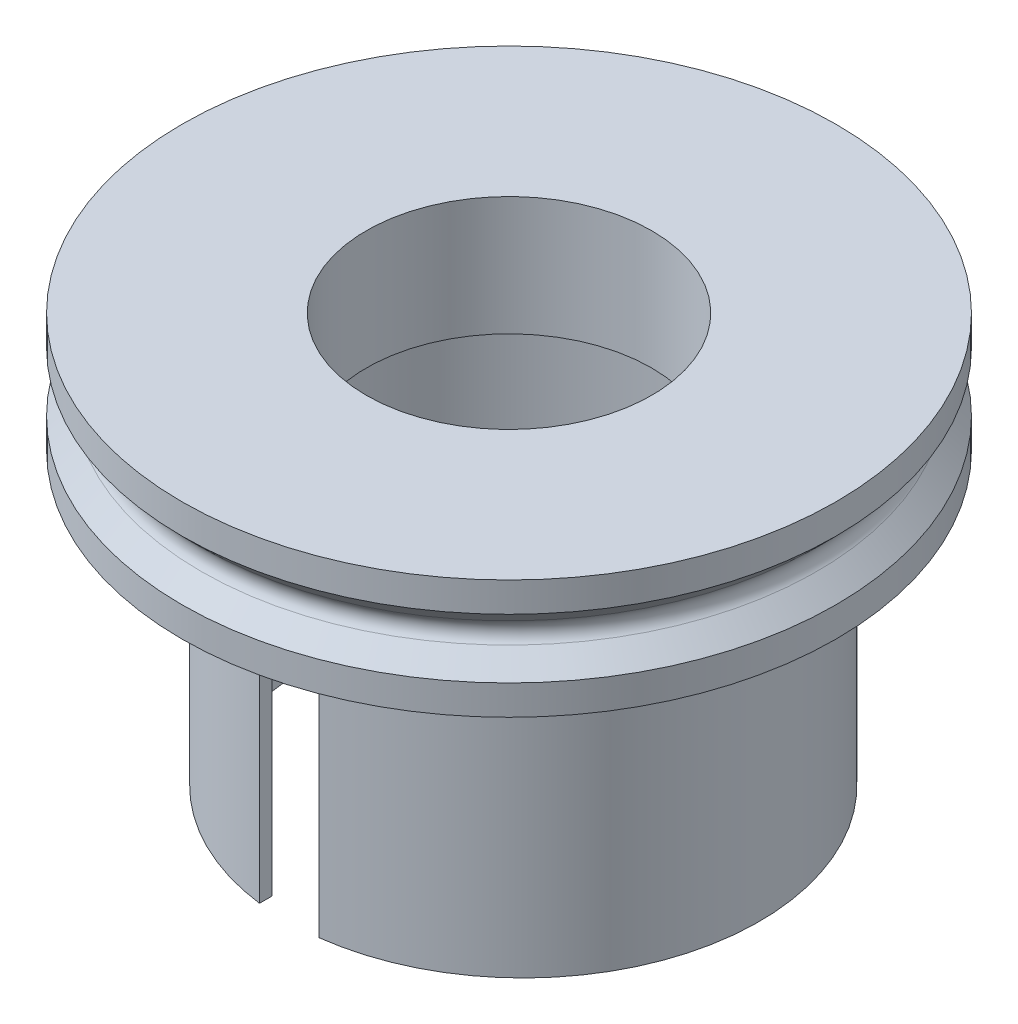
ISO-10303-21;
HEADER;
FILE_DESCRIPTION(('STEP AP214'),'2;1');
FILE_NAME('part.step','',(''),(''),'','','');
FILE_SCHEMA(('AUTOMOTIVE_DESIGN { 1 0 10303 214 1 1 1 1 }'));
ENDSEC;
DATA;
#1=APPLICATION_CONTEXT('core data for automotive mechanical design processes');
#2=APPLICATION_PROTOCOL_DEFINITION('international standard','automotive_design',2000,#1);
#3=PRODUCT_CONTEXT('',#1,'mechanical');
#4=PRODUCT('Part','Part','',(#3));
#5=PRODUCT_RELATED_PRODUCT_CATEGORY('part','',(#4));
#6=PRODUCT_DEFINITION_FORMATION('','',#4);
#7=PRODUCT_DEFINITION_CONTEXT('part definition',#1,'design');
#8=PRODUCT_DEFINITION('design','',#6,#7);
#9=PRODUCT_DEFINITION_SHAPE('','',#8);
#10=(LENGTH_UNIT() NAMED_UNIT(*) SI_UNIT(.MILLI.,.METRE.));
#11=(NAMED_UNIT(*) PLANE_ANGLE_UNIT() SI_UNIT($,.RADIAN.));
#12=(NAMED_UNIT(*) SI_UNIT($,.STERADIAN.) SOLID_ANGLE_UNIT());
#13=UNCERTAINTY_MEASURE_WITH_UNIT(LENGTH_MEASURE(1.E-05),#10,'distance_accuracy_value','');
#14=(GEOMETRIC_REPRESENTATION_CONTEXT(3) GLOBAL_UNCERTAINTY_ASSIGNED_CONTEXT((#13)) GLOBAL_UNIT_ASSIGNED_CONTEXT((#10,
#11,#12)) REPRESENTATION_CONTEXT('',''));
#15=CARTESIAN_POINT('',(0.,0.,0.));
#16=DIRECTION('',(0.,0.,1.));
#17=DIRECTION('',(1.,0.,0.));
#18=AXIS2_PLACEMENT_3D('',#15,#16,#17);
#19=CARTESIAN_POINT('',(0.,22.225,0.));
#20=DIRECTION('',(0.,-1.,0.));
#21=DIRECTION('',(0.,0.,-1.));
#22=AXIS2_PLACEMENT_3D('',#19,#20,#21);
#23=CYLINDRICAL_SURFACE('',#22,17.4625);
#24=CARTESIAN_POINT('',(0.,20.6375,0.));
#25=DIRECTION('',(0.,1.,0.));
#26=DIRECTION('',(0.,0.,1.));
#27=AXIS2_PLACEMENT_3D('',#24,#25,#26);
#28=CIRCLE('',#27,17.4625);
#29=CARTESIAN_POINT('',(0.,20.6375,17.4625));
#30=VERTEX_POINT('',#29);
#31=EDGE_CURVE('E110',#30,#30,#28,.T.);
#32=ORIENTED_EDGE('',*,*,#31,.T.);
#33=EDGE_LOOP('',(#32));
#34=FACE_BOUND('',#33,.T.);
#35=CARTESIAN_POINT('',(0.,22.225,0.));
#36=DIRECTION('',(0.,1.,0.));
#37=DIRECTION('',(0.,0.,1.));
#38=AXIS2_PLACEMENT_3D('',#35,#36,#37);
#39=CIRCLE('',#38,17.4625);
#40=CARTESIAN_POINT('',(0.,22.225,17.4625));
#41=VERTEX_POINT('',#40);
#42=EDGE_CURVE('E120',#41,#41,#39,.T.);
#43=ORIENTED_EDGE('',*,*,#42,.F.);
#44=EDGE_LOOP('',(#43));
#45=FACE_BOUND('',#44,.T.);
#46=ADVANCED_FACE('F33',(#34,#45),#23,.T.);
#47=CARTESIAN_POINT('',(0.,0.,-0.762));
#48=DIRECTION('',(0.,1.,0.));
#49=DIRECTION('',(0.,0.,1.));
#50=AXIS2_PLACEMENT_3D('',#47,#48,#49);
#51=PLANE('',#50);
#52=CARTESIAN_POINT('',(0.,0.,-0.762));
#53=DIRECTION('',(0.,1.,0.));
#54=DIRECTION('',(0.,0.,1.));
#55=AXIS2_PLACEMENT_3D('',#52,#53,#54);
#56=CIRCLE('',#55,12.6);
#57=CARTESIAN_POINT('',(1.5875,0.,11.7375937433982));
#58=VERTEX_POINT('',#57);
#59=CARTESIAN_POINT('',(-1.5875,0.,11.7375937433982));
#60=VERTEX_POINT('',#59);
#61=EDGE_CURVE('E37',#58,#60,#56,.T.);
#62=ORIENTED_EDGE('',*,*,#61,.F.);
#63=DIRECTION('',(0.,0.,1.));
#64=VECTOR('',#63,1.);
#65=CARTESIAN_POINT('',(1.5875,0.,19.8120009795949));
#66=LINE('',#65,#64);
#67=CARTESIAN_POINT('',(1.5875,0.,11.0626768799419));
#68=VERTEX_POINT('',#67);
#69=EDGE_CURVE('E56',#68,#58,#66,.T.);
#70=ORIENTED_EDGE('',*,*,#69,.F.);
#71=CARTESIAN_POINT('',(0.,0.,0.));
#72=DIRECTION('',(0.,1.,0.));
#73=DIRECTION('',(0.,0.,1.));
#74=AXIS2_PLACEMENT_3D('',#71,#72,#73);
#75=CIRCLE('',#74,11.176);
#76=CARTESIAN_POINT('',(-1.5875,0.,11.0626768799419));
#77=VERTEX_POINT('',#76);
#78=EDGE_CURVE('E126',#68,#77,#75,.T.);
#79=ORIENTED_EDGE('',*,*,#78,.T.);
#80=DIRECTION('',(0.,0.,-1.));
#81=VECTOR('',#80,1.);
#82=CARTESIAN_POINT('',(-1.5875,0.,19.8120009795949));
#83=LINE('',#82,#81);
#84=EDGE_CURVE('E48',#60,#77,#83,.T.);
#85=ORIENTED_EDGE('',*,*,#84,.F.);
#86=EDGE_LOOP('',(#62,#70,#79,#85));
#87=FACE_BOUND('',#86,.T.);
#88=ADVANCED_FACE('F130',(#87),#51,.F.);
#89=CARTESIAN_POINT('',(0.,15.875,-0.762));
#90=DIRECTION('',(0.,-1.,0.));
#91=DIRECTION('',(0.,0.,-1.));
#92=AXIS2_PLACEMENT_3D('',#89,#90,#91);
#93=CYLINDRICAL_SURFACE('',#92,12.6);
#94=CARTESIAN_POINT('',(0.,15.875,-0.762));
#95=DIRECTION('',(0.,1.,0.));
#96=DIRECTION('',(0.,0.,1.));
#97=AXIS2_PLACEMENT_3D('',#94,#95,#96);
#98=CIRCLE('',#97,12.6);
#99=CARTESIAN_POINT('',(1.5875,15.875,11.7375937433982));
#100=VERTEX_POINT('',#99);
#101=CARTESIAN_POINT('',(-1.5875,15.875,11.7375937433982));
#102=VERTEX_POINT('',#101);
#103=EDGE_CURVE('E11',#100,#102,#98,.T.);
#104=ORIENTED_EDGE('',*,*,#103,.F.);
#105=DIRECTION('',(0.,-1.,0.));
#106=VECTOR('',#105,1.);
#107=CARTESIAN_POINT('',(1.5875,15.875,11.7375937433982));
#108=LINE('',#107,#106);
#109=EDGE_CURVE('E99',#100,#58,#108,.T.);
#110=ORIENTED_EDGE('',*,*,#109,.T.);
#111=ORIENTED_EDGE('',*,*,#61,.T.);
#112=DIRECTION('',(0.,-1.,0.));
#113=VECTOR('',#112,1.);
#114=CARTESIAN_POINT('',(-1.5875,15.875,11.7375937433982));
#115=LINE('',#114,#113);
#116=EDGE_CURVE('E75',#60,#102,#115,.F.);
#117=ORIENTED_EDGE('',*,*,#116,.T.);
#118=EDGE_LOOP('',(#104,#110,#111,#117));
#119=FACE_BOUND('',#118,.T.);
#120=ADVANCED_FACE('F35',(#119),#93,.T.);
#121=CARTESIAN_POINT('',(0.,15.875,0.));
#122=DIRECTION('',(0.,-1.,0.));
#123=DIRECTION('',(0.,0.,-1.));
#124=AXIS2_PLACEMENT_3D('',#121,#122,#123);
#125=CYLINDRICAL_SURFACE('',#124,11.176);
#126=DIRECTION('',(0.,-1.,0.));
#127=VECTOR('',#126,1.);
#128=CARTESIAN_POINT('',(1.5875,15.875,11.0626768799419));
#129=LINE('',#128,#127);
#130=CARTESIAN_POINT('',(1.5875,15.875,11.0626768799419));
#131=VERTEX_POINT('',#130);
#132=EDGE_CURVE('E86',#131,#68,#129,.T.);
#133=ORIENTED_EDGE('',*,*,#132,.F.);
#134=CARTESIAN_POINT('',(0.,15.875,0.));
#135=DIRECTION('',(0.,1.,0.));
#136=DIRECTION('',(0.,0.,1.));
#137=AXIS2_PLACEMENT_3D('',#134,#135,#136);
#138=CIRCLE('',#137,11.176);
#139=CARTESIAN_POINT('',(-1.5875,15.875,11.0626768799419));
#140=VERTEX_POINT('',#139);
#141=EDGE_CURVE('E91',#131,#140,#138,.T.);
#142=ORIENTED_EDGE('',*,*,#141,.T.);
#143=DIRECTION('',(0.,-1.,0.));
#144=VECTOR('',#143,1.);
#145=CARTESIAN_POINT('',(-1.5875,15.875,11.0626768799419));
#146=LINE('',#145,#144);
#147=EDGE_CURVE('E76',#77,#140,#146,.F.);
#148=ORIENTED_EDGE('',*,*,#147,.F.);
#149=ORIENTED_EDGE('',*,*,#78,.F.);
#150=EDGE_LOOP('',(#133,#142,#148,#149));
#151=FACE_BOUND('',#150,.T.);
#152=ADVANCED_FACE('F132',(#151),#125,.F.);
#153=CARTESIAN_POINT('',(0.,15.875,0.));
#154=DIRECTION('',(0.,1.,0.));
#155=DIRECTION('',(0.,0.,1.));
#156=AXIS2_PLACEMENT_3D('',#153,#154,#155);
#157=PLANE('',#156);
#158=CARTESIAN_POINT('',(0.,15.875,0.));
#159=DIRECTION('',(0.,1.,0.));
#160=DIRECTION('',(0.,0.,1.));
#161=AXIS2_PLACEMENT_3D('',#158,#159,#160);
#162=CIRCLE('',#161,7.62);
#163=CARTESIAN_POINT('',(0.,15.875,7.62));
#164=VERTEX_POINT('',#163);
#165=EDGE_CURVE('E113',#164,#164,#162,.T.);
#166=ORIENTED_EDGE('',*,*,#165,.T.);
#167=EDGE_LOOP('',(#166));
#168=FACE_BOUND('',#167,.T.);
#169=ORIENTED_EDGE('',*,*,#141,.F.);
#170=DIRECTION('',(0.,0.,1.));
#171=VECTOR('',#170,1.);
#172=CARTESIAN_POINT('',(1.5875,15.875,19.8120009795949));
#173=LINE('',#172,#171);
#174=EDGE_CURVE('E80',#131,#100,#173,.T.);
#175=ORIENTED_EDGE('',*,*,#174,.T.);
#176=ORIENTED_EDGE('',*,*,#103,.T.);
#177=DIRECTION('',(0.,0.,-1.));
#178=VECTOR('',#177,1.);
#179=CARTESIAN_POINT('',(-1.5875,15.875,19.8120009795949));
#180=LINE('',#179,#178);
#181=EDGE_CURVE('E72',#102,#140,#180,.T.);
#182=ORIENTED_EDGE('',*,*,#181,.T.);
#183=EDGE_LOOP('',(#169,#175,#176,#182));
#184=FACE_BOUND('',#183,.T.);
#185=CARTESIAN_POINT('',(0.,15.875,0.));
#186=DIRECTION('',(0.,1.,0.));
#187=DIRECTION('',(0.,0.,1.));
#188=AXIS2_PLACEMENT_3D('',#185,#186,#187);
#189=CIRCLE('',#188,17.4625);
#190=CARTESIAN_POINT('',(0.,15.875,17.4625));
#191=VERTEX_POINT('',#190);
#192=EDGE_CURVE('E117',#191,#191,#189,.T.);
#193=ORIENTED_EDGE('',*,*,#192,.F.);
#194=EDGE_LOOP('',(#193));
#195=FACE_BOUND('',#194,.T.);
#196=ADVANCED_FACE('F89',(#168,#184,#195),#157,.F.);
#197=CARTESIAN_POINT('',(0.,22.225,0.));
#198=DIRECTION('',(0.,1.,0.));
#199=DIRECTION('',(0.,0.,1.));
#200=AXIS2_PLACEMENT_3D('',#197,#198,#199);
#201=PLANE('',#200);
#202=ORIENTED_EDGE('',*,*,#42,.T.);
#203=EDGE_LOOP('',(#202));
#204=FACE_BOUND('',#203,.T.);
#205=CARTESIAN_POINT('',(0.,22.225,0.));
#206=DIRECTION('',(0.,1.,0.));
#207=DIRECTION('',(0.,0.,1.));
#208=AXIS2_PLACEMENT_3D('',#205,#206,#207);
#209=CIRCLE('',#208,7.62);
#210=CARTESIAN_POINT('',(0.,22.225,7.62));
#211=VERTEX_POINT('',#210);
#212=EDGE_CURVE('E114',#211,#211,#209,.T.);
#213=ORIENTED_EDGE('',*,*,#212,.F.);
#214=EDGE_LOOP('',(#213));
#215=FACE_BOUND('',#214,.T.);
#216=ADVANCED_FACE('F157',(#204,#215),#201,.T.);
#217=CARTESIAN_POINT('',(0.,17.4625,0.));
#218=DIRECTION('',(0.,1.,0.));
#219=DIRECTION('',(0.,0.,1.));
#220=AXIS2_PLACEMENT_3D('',#217,#218,#219);
#221=CIRCLE('',#220,17.4625);
#222=CARTESIAN_POINT('',(0.,17.4625,17.4625));
#223=VERTEX_POINT('',#222);
#224=EDGE_CURVE('E101',#223,#223,#221,.T.);
#225=ORIENTED_EDGE('',*,*,#224,.F.);
#226=EDGE_LOOP('',(#225));
#227=FACE_BOUND('',#226,.T.);
#228=ORIENTED_EDGE('',*,*,#192,.T.);
#229=EDGE_LOOP('',(#228));
#230=FACE_BOUND('',#229,.T.);
#231=ADVANCED_FACE('F148',(#227,#230),#23,.T.);
#232=CARTESIAN_POINT('',(0.,22.225,0.));
#233=DIRECTION('',(0.,-1.,0.));
#234=DIRECTION('',(0.,0.,-1.));
#235=AXIS2_PLACEMENT_3D('',#232,#233,#234);
#236=CYLINDRICAL_SURFACE('',#235,7.62);
#237=ORIENTED_EDGE('',*,*,#212,.T.);
#238=EDGE_LOOP('',(#237));
#239=FACE_BOUND('',#238,.T.);
#240=ORIENTED_EDGE('',*,*,#165,.F.);
#241=EDGE_LOOP('',(#240));
#242=FACE_BOUND('',#241,.T.);
#243=ADVANCED_FACE('F156',(#239,#242),#236,.F.);
#244=CARTESIAN_POINT('',(0.,19.6112660075668,0.));
#245=DIRECTION('',(0.,1.,0.));
#246=DIRECTION('',(0.,0.,1.));
#247=AXIS2_PLACEMENT_3D('',#244,#245,#246);
#248=CONICAL_SURFACE('',#247,16.4362660075668,0.78539816339745);
#249=ORIENTED_EDGE('',*,*,#31,.F.);
#250=EDGE_LOOP('',(#249));
#251=FACE_BOUND('',#250,.T.);
#252=CARTESIAN_POINT('',(0.,19.6112660075668,0.));
#253=DIRECTION('',(0.,1.,0.));
#254=DIRECTION('',(0.,0.,1.));
#255=AXIS2_PLACEMENT_3D('',#252,#253,#254);
#256=CIRCLE('',#255,16.4362660075668);
#257=CARTESIAN_POINT('',(0.,19.6112660075668,16.4362660075668));
#258=VERTEX_POINT('',#257);
#259=EDGE_CURVE('E107',#258,#258,#256,.T.);
#260=ORIENTED_EDGE('',*,*,#259,.T.);
#261=EDGE_LOOP('',(#260));
#262=FACE_BOUND('',#261,.T.);
#263=ADVANCED_FACE('F163',(#251,#262),#248,.T.);
#264=CARTESIAN_POINT('',(0.,19.05,0.));
#265=DIRECTION('',(0.,1.,0.));
#266=DIRECTION('',(0.,0.,1.));
#267=AXIS2_PLACEMENT_3D('',#264,#265,#266);
#268=TOROIDAL_SURFACE('',#267,16.9975320151336,0.793749999999999);
#269=ORIENTED_EDGE('',*,*,#259,.F.);
#270=EDGE_LOOP('',(#269));
#271=FACE_BOUND('',#270,.T.);
#272=CARTESIAN_POINT('',(0.,18.4887339924332,0.));
#273=DIRECTION('',(0.,1.,0.));
#274=DIRECTION('',(0.,0.,1.));
#275=AXIS2_PLACEMENT_3D('',#272,#273,#274);
#276=CIRCLE('',#275,16.4362660075668);
#277=CARTESIAN_POINT('',(0.,18.4887339924332,16.4362660075668));
#278=VERTEX_POINT('',#277);
#279=EDGE_CURVE('E104',#278,#278,#276,.T.);
#280=ORIENTED_EDGE('',*,*,#279,.T.);
#281=EDGE_LOOP('',(#280));
#282=FACE_BOUND('',#281,.T.);
#283=ADVANCED_FACE('F142',(#271,#282),#268,.F.);
#284=CARTESIAN_POINT('',(0.,17.4625,0.));
#285=DIRECTION('',(0.,-1.,0.));
#286=DIRECTION('',(0.,0.,-1.));
#287=AXIS2_PLACEMENT_3D('',#284,#285,#286);
#288=CONICAL_SURFACE('',#287,17.4625,0.78539816339745);
#289=ORIENTED_EDGE('',*,*,#279,.F.);
#290=EDGE_LOOP('',(#289));
#291=FACE_BOUND('',#290,.T.);
#292=ORIENTED_EDGE('',*,*,#224,.T.);
#293=EDGE_LOOP('',(#292));
#294=FACE_BOUND('',#293,.T.);
#295=ADVANCED_FACE('F135',(#291,#294),#288,.T.);
#296=CARTESIAN_POINT('',(1.5875,32.1359775687172,19.8120009795949));
#297=DIRECTION('',(1.,0.,0.));
#298=DIRECTION('',(0.,0.,-1.));
#299=AXIS2_PLACEMENT_3D('',#296,#297,#298);
#300=PLANE('',#299);
#301=ORIENTED_EDGE('',*,*,#174,.F.);
#302=ORIENTED_EDGE('',*,*,#132,.T.);
#303=ORIENTED_EDGE('',*,*,#69,.T.);
#304=ORIENTED_EDGE('',*,*,#109,.F.);
#305=EDGE_LOOP('',(#301,#302,#303,#304));
#306=FACE_BOUND('',#305,.T.);
#307=ADVANCED_FACE('F133',(#306),#300,.F.);
#308=CARTESIAN_POINT('',(-1.5875,32.1359775687172,19.8120009795949));
#309=DIRECTION('',(-1.,0.,0.));
#310=DIRECTION('',(0.,0.,1.));
#311=AXIS2_PLACEMENT_3D('',#308,#309,#310);
#312=PLANE('',#311);
#313=ORIENTED_EDGE('',*,*,#84,.T.);
#314=ORIENTED_EDGE('',*,*,#147,.T.);
#315=ORIENTED_EDGE('',*,*,#181,.F.);
#316=ORIENTED_EDGE('',*,*,#116,.F.);
#317=EDGE_LOOP('',(#313,#314,#315,#316));
#318=FACE_BOUND('',#317,.T.);
#319=ADVANCED_FACE('F74',(#318),#312,.F.);
#320=CLOSED_SHELL('',(#46,#88,#120,#152,#196,#216,#231,#243,#263,#283,#295,#307,#319));
#321=MANIFOLD_SOLID_BREP('B2',#320);
#322=ADVANCED_BREP_SHAPE_REPRESENTATION('',(#18,#321),#14);
#323=SHAPE_DEFINITION_REPRESENTATION(#9,#322);
ENDSEC;
END-ISO-10303-21;
